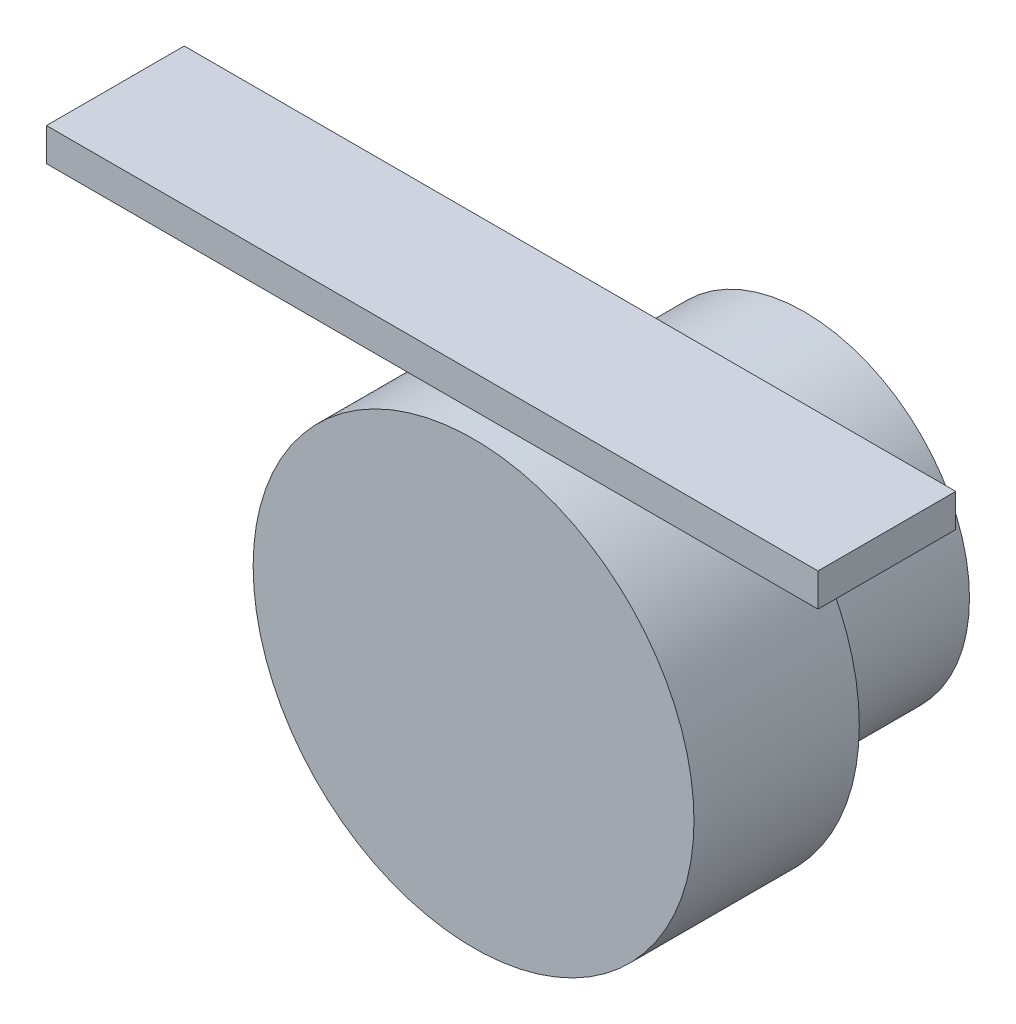
ISO-10303-21;
HEADER;
FILE_DESCRIPTION(('STEP AP214'),'2;1');
FILE_NAME('part.step','',(''),(''),'','','');
FILE_SCHEMA(('AUTOMOTIVE_DESIGN { 1 0 10303 214 1 1 1 1 }'));
ENDSEC;
DATA;
#1=APPLICATION_CONTEXT('core data for automotive mechanical design processes');
#2=APPLICATION_PROTOCOL_DEFINITION('international standard','automotive_design',2000,#1);
#3=PRODUCT_CONTEXT('',#1,'mechanical');
#4=PRODUCT('Part','Part','',(#3));
#5=PRODUCT_RELATED_PRODUCT_CATEGORY('part','',(#4));
#6=PRODUCT_DEFINITION_FORMATION('','',#4);
#7=PRODUCT_DEFINITION_CONTEXT('part definition',#1,'design');
#8=PRODUCT_DEFINITION('design','',#6,#7);
#9=PRODUCT_DEFINITION_SHAPE('','',#8);
#10=(LENGTH_UNIT() NAMED_UNIT(*) SI_UNIT(.MILLI.,.METRE.));
#11=(NAMED_UNIT(*) PLANE_ANGLE_UNIT() SI_UNIT($,.RADIAN.));
#12=(NAMED_UNIT(*) SI_UNIT($,.STERADIAN.) SOLID_ANGLE_UNIT());
#13=UNCERTAINTY_MEASURE_WITH_UNIT(LENGTH_MEASURE(1.E-05),#10,'distance_accuracy_value','');
#14=(GEOMETRIC_REPRESENTATION_CONTEXT(3) GLOBAL_UNCERTAINTY_ASSIGNED_CONTEXT((#13)) GLOBAL_UNIT_ASSIGNED_CONTEXT((#10,
#11,#12)) REPRESENTATION_CONTEXT('',''));
#15=CARTESIAN_POINT('',(0.,0.,0.));
#16=DIRECTION('',(0.,0.,1.));
#17=DIRECTION('',(1.,0.,0.));
#18=AXIS2_PLACEMENT_3D('',#15,#16,#17);
#19=CARTESIAN_POINT('',(14.,10.4,4.5));
#20=DIRECTION('',(-1.,0.,0.));
#21=DIRECTION('',(0.,0.,1.));
#22=AXIS2_PLACEMENT_3D('',#19,#20,#21);
#23=PLANE('',#22);
#24=DIRECTION('',(0.,1.,0.));
#25=VECTOR('',#24,1.);
#26=CARTESIAN_POINT('',(14.,10.4,-0.5));
#27=LINE('',#26,#25);
#28=CARTESIAN_POINT('',(14.,10.4,-0.5));
#29=VERTEX_POINT('',#28);
#30=CARTESIAN_POINT('',(14.,11.6,-0.5));
#31=VERTEX_POINT('',#30);
#32=EDGE_CURVE('E107',#29,#31,#27,.T.);
#33=ORIENTED_EDGE('',*,*,#32,.T.);
#34=DIRECTION('',(0.,0.,-1.));
#35=VECTOR('',#34,1.);
#36=CARTESIAN_POINT('',(14.,11.6,4.5));
#37=LINE('',#36,#35);
#38=CARTESIAN_POINT('',(14.,11.6,4.5));
#39=VERTEX_POINT('',#38);
#40=EDGE_CURVE('E12',#39,#31,#37,.T.);
#41=ORIENTED_EDGE('',*,*,#40,.F.);
#42=DIRECTION('',(0.,1.,0.));
#43=VECTOR('',#42,1.);
#44=CARTESIAN_POINT('',(14.,10.4,4.5));
#45=LINE('',#44,#43);
#46=CARTESIAN_POINT('',(14.,10.4,4.5));
#47=VERTEX_POINT('',#46);
#48=EDGE_CURVE('E95',#47,#39,#45,.T.);
#49=ORIENTED_EDGE('',*,*,#48,.F.);
#50=DIRECTION('',(0.,0.,-1.));
#51=VECTOR('',#50,1.);
#52=CARTESIAN_POINT('',(14.,10.4,4.5));
#53=LINE('',#52,#51);
#54=EDGE_CURVE('E103',#47,#29,#53,.T.);
#55=ORIENTED_EDGE('',*,*,#54,.T.);
#56=EDGE_LOOP('',(#33,#41,#49,#55));
#57=FACE_BOUND('',#56,.T.);
#58=ADVANCED_FACE('F44',(#57),#23,.F.);
#59=CARTESIAN_POINT('',(-14.,11.6,4.5));
#60=DIRECTION('',(0.,-1.,0.));
#61=DIRECTION('',(0.,0.,-1.));
#62=AXIS2_PLACEMENT_3D('',#59,#60,#61);
#63=PLANE('',#62);
#64=DIRECTION('',(-1.,0.,0.));
#65=VECTOR('',#64,1.);
#66=CARTESIAN_POINT('',(-14.,11.6,-0.5));
#67=LINE('',#66,#65);
#68=CARTESIAN_POINT('',(-14.,11.6,-0.5));
#69=VERTEX_POINT('',#68);
#70=EDGE_CURVE('E99',#31,#69,#67,.T.);
#71=ORIENTED_EDGE('',*,*,#70,.T.);
#72=DIRECTION('',(0.,0.,-1.));
#73=VECTOR('',#72,1.);
#74=CARTESIAN_POINT('',(-14.,11.6,4.5));
#75=LINE('',#74,#73);
#76=CARTESIAN_POINT('',(-14.,11.6,4.5));
#77=VERTEX_POINT('',#76);
#78=EDGE_CURVE('E52',#77,#69,#75,.T.);
#79=ORIENTED_EDGE('',*,*,#78,.F.);
#80=DIRECTION('',(-1.,0.,0.));
#81=VECTOR('',#80,1.);
#82=CARTESIAN_POINT('',(-14.,11.6,4.5));
#83=LINE('',#82,#81);
#84=EDGE_CURVE('E90',#39,#77,#83,.T.);
#85=ORIENTED_EDGE('',*,*,#84,.F.);
#86=ORIENTED_EDGE('',*,*,#40,.T.);
#87=EDGE_LOOP('',(#71,#79,#85,#86));
#88=FACE_BOUND('',#87,.T.);
#89=ADVANCED_FACE('F98',(#88),#63,.F.);
#90=CARTESIAN_POINT('',(-14.,10.4,4.5));
#91=DIRECTION('',(1.,0.,0.));
#92=DIRECTION('',(0.,0.,-1.));
#93=AXIS2_PLACEMENT_3D('',#90,#91,#92);
#94=PLANE('',#93);
#95=DIRECTION('',(0.,-1.,0.));
#96=VECTOR('',#95,1.);
#97=CARTESIAN_POINT('',(-14.,10.4,-0.5));
#98=LINE('',#97,#96);
#99=CARTESIAN_POINT('',(-14.,10.4,-0.5));
#100=VERTEX_POINT('',#99);
#101=EDGE_CURVE('E77',#69,#100,#98,.T.);
#102=ORIENTED_EDGE('',*,*,#101,.T.);
#103=DIRECTION('',(0.,0.,-1.));
#104=VECTOR('',#103,1.);
#105=CARTESIAN_POINT('',(-14.,10.4,4.5));
#106=LINE('',#105,#104);
#107=CARTESIAN_POINT('',(-14.,10.4,4.5));
#108=VERTEX_POINT('',#107);
#109=EDGE_CURVE('E100',#108,#100,#106,.T.);
#110=ORIENTED_EDGE('',*,*,#109,.F.);
#111=DIRECTION('',(0.,-1.,0.));
#112=VECTOR('',#111,1.);
#113=CARTESIAN_POINT('',(-14.,10.4,4.5));
#114=LINE('',#113,#112);
#115=EDGE_CURVE('E93',#77,#108,#114,.T.);
#116=ORIENTED_EDGE('',*,*,#115,.F.);
#117=ORIENTED_EDGE('',*,*,#78,.T.);
#118=EDGE_LOOP('',(#102,#110,#116,#117));
#119=FACE_BOUND('',#118,.T.);
#120=ADVANCED_FACE('F101',(#119),#94,.F.);
#121=CARTESIAN_POINT('',(-14.,10.4,4.5));
#122=DIRECTION('',(0.,1.,0.));
#123=DIRECTION('',(0.,0.,1.));
#124=AXIS2_PLACEMENT_3D('',#121,#122,#123);
#125=PLANE('',#124);
#126=DIRECTION('',(1.,0.,0.));
#127=VECTOR('',#126,1.);
#128=CARTESIAN_POINT('',(-14.,10.4,-0.5));
#129=LINE('',#128,#127);
#130=EDGE_CURVE('E83',#100,#29,#129,.T.);
#131=ORIENTED_EDGE('',*,*,#130,.T.);
#132=ORIENTED_EDGE('',*,*,#54,.F.);
#133=DIRECTION('',(1.,0.,0.));
#134=VECTOR('',#133,1.);
#135=CARTESIAN_POINT('',(-14.,10.4,4.5));
#136=LINE('',#135,#134);
#137=EDGE_CURVE('E60',#108,#47,#136,.T.);
#138=ORIENTED_EDGE('',*,*,#137,.F.);
#139=ORIENTED_EDGE('',*,*,#109,.T.);
#140=EDGE_LOOP('',(#131,#132,#138,#139));
#141=FACE_BOUND('',#140,.T.);
#142=ADVANCED_FACE('F114',(#141),#125,.F.);
#143=CARTESIAN_POINT('',(0.,0.,4.5));
#144=DIRECTION('',(0.,0.,-1.));
#145=DIRECTION('',(-1.,0.,0.));
#146=AXIS2_PLACEMENT_3D('',#143,#144,#145);
#147=PLANE('',#146);
#148=ORIENTED_EDGE('',*,*,#48,.T.);
#149=ORIENTED_EDGE('',*,*,#84,.T.);
#150=ORIENTED_EDGE('',*,*,#115,.T.);
#151=ORIENTED_EDGE('',*,*,#137,.T.);
#152=EDGE_LOOP('',(#148,#149,#150,#151));
#153=FACE_BOUND('',#152,.T.);
#154=ADVANCED_FACE('F91',(#153),#147,.F.);
#155=CARTESIAN_POINT('',(0.,0.,-0.5));
#156=DIRECTION('',(0.,0.,-1.));
#157=DIRECTION('',(-1.,0.,0.));
#158=AXIS2_PLACEMENT_3D('',#155,#156,#157);
#159=PLANE('',#158);
#160=ORIENTED_EDGE('',*,*,#32,.F.);
#161=ORIENTED_EDGE('',*,*,#130,.F.);
#162=ORIENTED_EDGE('',*,*,#101,.F.);
#163=ORIENTED_EDGE('',*,*,#70,.F.);
#164=EDGE_LOOP('',(#160,#161,#162,#163));
#165=FACE_BOUND('',#164,.T.);
#166=ADVANCED_FACE('F117',(#165),#159,.T.);
#167=CLOSED_SHELL('',(#58,#89,#120,#142,#154,#166));
#168=MANIFOLD_SOLID_BREP('B2',#167);
#169=CARTESIAN_POINT('',(0.,0.,-1.));
#170=DIRECTION('',(0.,0.,-1.));
#171=DIRECTION('',(-1.,0.,0.));
#172=AXIS2_PLACEMENT_3D('',#169,#170,#171);
#173=CYLINDRICAL_SURFACE('',#172,6.);
#174=CARTESIAN_POINT('',(0.,0.,-1.));
#175=DIRECTION('',(0.,0.,1.));
#176=DIRECTION('',(1.,0.,0.));
#177=AXIS2_PLACEMENT_3D('',#174,#175,#176);
#178=CIRCLE('',#177,6.);
#179=CARTESIAN_POINT('',(6.,0.,-1.));
#180=VERTEX_POINT('',#179);
#181=EDGE_CURVE('E43',#180,#180,#178,.T.);
#182=ORIENTED_EDGE('',*,*,#181,.F.);
#183=EDGE_LOOP('',(#182));
#184=FACE_BOUND('',#183,.T.);
#185=CARTESIAN_POINT('',(0.,0.,-9.));
#186=DIRECTION('',(0.,0.,1.));
#187=DIRECTION('',(1.,0.,0.));
#188=AXIS2_PLACEMENT_3D('',#185,#186,#187);
#189=CIRCLE('',#188,6.);
#190=CARTESIAN_POINT('',(6.,0.,-9.));
#191=VERTEX_POINT('',#190);
#192=EDGE_CURVE('E178',#191,#191,#189,.T.);
#193=ORIENTED_EDGE('',*,*,#192,.T.);
#194=EDGE_LOOP('',(#193));
#195=FACE_BOUND('',#194,.T.);
#196=ADVANCED_FACE('F175',(#184,#195),#173,.T.);
#197=CARTESIAN_POINT('',(0.,0.,-1.));
#198=DIRECTION('',(0.,0.,1.));
#199=DIRECTION('',(1.,0.,0.));
#200=AXIS2_PLACEMENT_3D('',#197,#198,#199);
#201=PLANE('',#200);
#202=ORIENTED_EDGE('',*,*,#181,.T.);
#203=EDGE_LOOP('',(#202));
#204=FACE_BOUND('',#203,.T.);
#205=ADVANCED_FACE('F190',(#204),#201,.T.);
#206=CARTESIAN_POINT('',(0.,0.,-9.));
#207=DIRECTION('',(0.,0.,1.));
#208=DIRECTION('',(1.,0.,0.));
#209=AXIS2_PLACEMENT_3D('',#206,#207,#208);
#210=PLANE('',#209);
#211=ORIENTED_EDGE('',*,*,#192,.F.);
#212=EDGE_LOOP('',(#211));
#213=FACE_BOUND('',#212,.T.);
#214=ADVANCED_FACE('F188',(#213),#210,.F.);
#215=CLOSED_SHELL('',(#196,#205,#214));
#216=MANIFOLD_SOLID_BREP('B6',#215);
#217=CARTESIAN_POINT('',(0.,0.,3.));
#218=DIRECTION('',(0.,0.,-1.));
#219=DIRECTION('',(-1.,0.,0.));
#220=AXIS2_PLACEMENT_3D('',#217,#218,#219);
#221=CYLINDRICAL_SURFACE('',#220,8.);
#222=CARTESIAN_POINT('',(0.,0.,3.));
#223=DIRECTION('',(0.,0.,1.));
#224=DIRECTION('',(1.,0.,0.));
#225=AXIS2_PLACEMENT_3D('',#222,#223,#224);
#226=CIRCLE('',#225,8.);
#227=CARTESIAN_POINT('',(8.,0.,3.));
#228=VERTEX_POINT('',#227);
#229=EDGE_CURVE('E174',#228,#228,#226,.T.);
#230=ORIENTED_EDGE('',*,*,#229,.F.);
#231=EDGE_LOOP('',(#230));
#232=FACE_BOUND('',#231,.T.);
#233=CARTESIAN_POINT('',(0.,0.,-3.));
#234=DIRECTION('',(0.,0.,1.));
#235=DIRECTION('',(1.,0.,0.));
#236=AXIS2_PLACEMENT_3D('',#233,#234,#235);
#237=CIRCLE('',#236,8.);
#238=CARTESIAN_POINT('',(8.,0.,-3.));
#239=VERTEX_POINT('',#238);
#240=EDGE_CURVE('E219',#239,#239,#237,.T.);
#241=ORIENTED_EDGE('',*,*,#240,.T.);
#242=EDGE_LOOP('',(#241));
#243=FACE_BOUND('',#242,.T.);
#244=ADVANCED_FACE('F216',(#232,#243),#221,.T.);
#245=CARTESIAN_POINT('',(0.,0.,3.));
#246=DIRECTION('',(0.,0.,1.));
#247=DIRECTION('',(1.,0.,0.));
#248=AXIS2_PLACEMENT_3D('',#245,#246,#247);
#249=PLANE('',#248);
#250=ORIENTED_EDGE('',*,*,#229,.T.);
#251=EDGE_LOOP('',(#250));
#252=FACE_BOUND('',#251,.T.);
#253=ADVANCED_FACE('F231',(#252),#249,.T.);
#254=CARTESIAN_POINT('',(0.,0.,-3.));
#255=DIRECTION('',(0.,0.,1.));
#256=DIRECTION('',(1.,0.,0.));
#257=AXIS2_PLACEMENT_3D('',#254,#255,#256);
#258=PLANE('',#257);
#259=ORIENTED_EDGE('',*,*,#240,.F.);
#260=EDGE_LOOP('',(#259));
#261=FACE_BOUND('',#260,.T.);
#262=ADVANCED_FACE('F229',(#261),#258,.F.);
#263=CLOSED_SHELL('',(#244,#253,#262));
#264=MANIFOLD_SOLID_BREP('B38',#263);
#265=ADVANCED_BREP_SHAPE_REPRESENTATION('',(#18,#168,#216,#264),#14);
#266=SHAPE_DEFINITION_REPRESENTATION(#9,#265);
ENDSEC;
END-ISO-10303-21;
